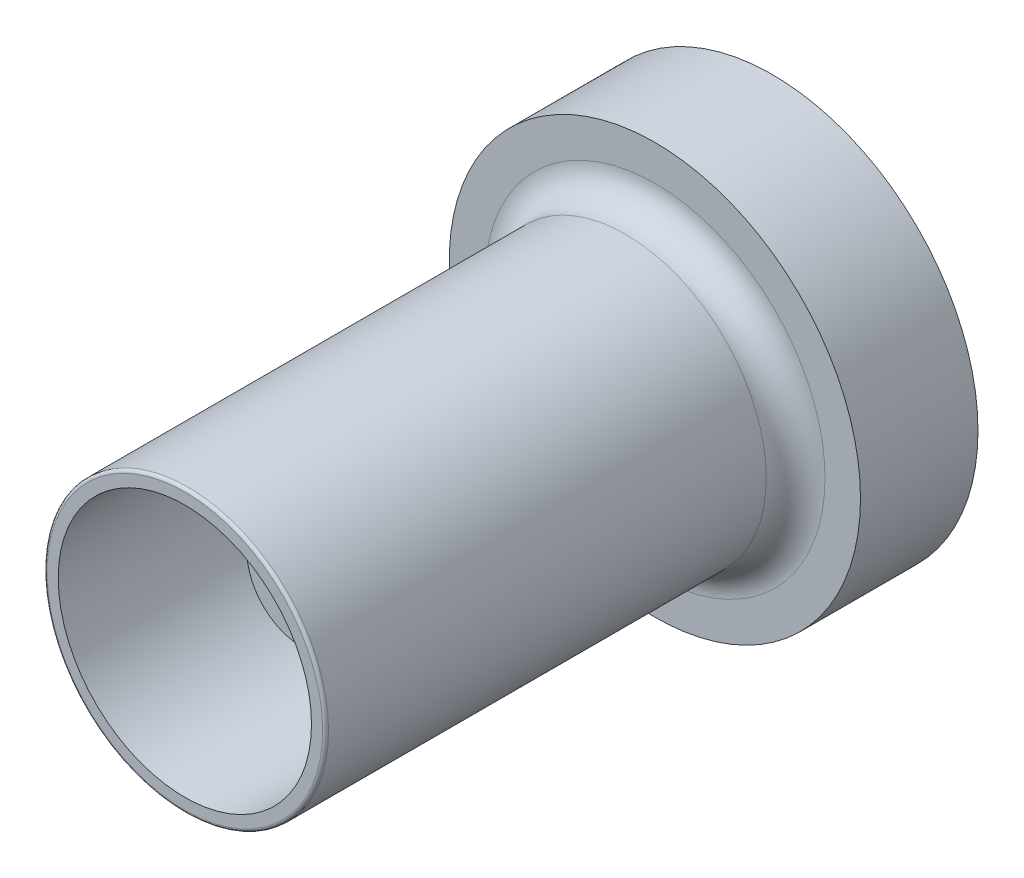
ISO-10303-21;
HEADER;
FILE_DESCRIPTION(('STEP AP214'),'2;1');
FILE_NAME('part.step','',(''),(''),'','','');
FILE_SCHEMA(('AUTOMOTIVE_DESIGN { 1 0 10303 214 1 1 1 1 }'));
ENDSEC;
DATA;
#1=APPLICATION_CONTEXT('core data for automotive mechanical design processes');
#2=APPLICATION_PROTOCOL_DEFINITION('international standard','automotive_design',2000,#1);
#3=PRODUCT_CONTEXT('',#1,'mechanical');
#4=PRODUCT('Part','Part','',(#3));
#5=PRODUCT_RELATED_PRODUCT_CATEGORY('part','',(#4));
#6=PRODUCT_DEFINITION_FORMATION('','',#4);
#7=PRODUCT_DEFINITION_CONTEXT('part definition',#1,'design');
#8=PRODUCT_DEFINITION('design','',#6,#7);
#9=PRODUCT_DEFINITION_SHAPE('','',#8);
#10=(LENGTH_UNIT() NAMED_UNIT(*) SI_UNIT(.MILLI.,.METRE.));
#11=(NAMED_UNIT(*) PLANE_ANGLE_UNIT() SI_UNIT($,.RADIAN.));
#12=(NAMED_UNIT(*) SI_UNIT($,.STERADIAN.) SOLID_ANGLE_UNIT());
#13=UNCERTAINTY_MEASURE_WITH_UNIT(LENGTH_MEASURE(1.E-05),#10,'distance_accuracy_value','');
#14=(GEOMETRIC_REPRESENTATION_CONTEXT(3) GLOBAL_UNCERTAINTY_ASSIGNED_CONTEXT((#13)) GLOBAL_UNIT_ASSIGNED_CONTEXT((#10,
#11,#12)) REPRESENTATION_CONTEXT('',''));
#15=CARTESIAN_POINT('',(0.,0.,0.));
#16=DIRECTION('',(0.,0.,1.));
#17=DIRECTION('',(1.,0.,0.));
#18=AXIS2_PLACEMENT_3D('',#15,#16,#17);
#19=CARTESIAN_POINT('',(0.,0.,4.));
#20=DIRECTION('',(0.,0.,-1.));
#21=DIRECTION('',(-1.,0.,0.));
#22=AXIS2_PLACEMENT_3D('',#19,#20,#21);
#23=CYLINDRICAL_SURFACE('',#22,7.);
#24=CARTESIAN_POINT('',(0.,0.,4.));
#25=DIRECTION('',(0.,0.,1.));
#26=DIRECTION('',(1.,0.,0.));
#27=AXIS2_PLACEMENT_3D('',#24,#25,#26);
#28=CIRCLE('',#27,7.);
#29=CARTESIAN_POINT('',(7.,0.,4.));
#30=VERTEX_POINT('',#29);
#31=EDGE_CURVE('E65',#30,#30,#28,.T.);
#32=ORIENTED_EDGE('',*,*,#31,.F.);
#33=EDGE_LOOP('',(#32));
#34=FACE_BOUND('',#33,.T.);
#35=CARTESIAN_POINT('',(0.,0.,0.));
#36=DIRECTION('',(0.,0.,1.));
#37=DIRECTION('',(1.,0.,0.));
#38=AXIS2_PLACEMENT_3D('',#35,#36,#37);
#39=CIRCLE('',#38,7.);
#40=CARTESIAN_POINT('',(7.,0.,0.));
#41=VERTEX_POINT('',#40);
#42=EDGE_CURVE('E66',#41,#41,#39,.T.);
#43=ORIENTED_EDGE('',*,*,#42,.T.);
#44=EDGE_LOOP('',(#43));
#45=FACE_BOUND('',#44,.T.);
#46=ADVANCED_FACE('F37',(#34,#45),#23,.T.);
#47=CARTESIAN_POINT('',(0.,0.,4.));
#48=DIRECTION('',(0.,0.,1.));
#49=DIRECTION('',(1.,0.,0.));
#50=AXIS2_PLACEMENT_3D('',#47,#48,#49);
#51=PLANE('',#50);
#52=CARTESIAN_POINT('',(0.,0.,4.));
#53=DIRECTION('',(0.,0.,1.));
#54=DIRECTION('',(1.,0.,0.));
#55=AXIS2_PLACEMENT_3D('',#52,#53,#54);
#56=CIRCLE('',#55,5.79128729213169);
#57=CARTESIAN_POINT('',(5.79128729213169,0.,4.));
#58=VERTEX_POINT('',#57);
#59=EDGE_CURVE('E50',#58,#58,#56,.F.);
#60=ORIENTED_EDGE('',*,*,#59,.T.);
#61=EDGE_LOOP('',(#60));
#62=FACE_BOUND('',#61,.T.);
#63=ORIENTED_EDGE('',*,*,#31,.T.);
#64=EDGE_LOOP('',(#63));
#65=FACE_BOUND('',#64,.T.);
#66=ADVANCED_FACE('F115',(#62,#65),#51,.T.);
#67=CARTESIAN_POINT('',(0.,0.,0.));
#68=DIRECTION('',(0.,0.,1.));
#69=DIRECTION('',(1.,0.,0.));
#70=AXIS2_PLACEMENT_3D('',#67,#68,#69);
#71=PLANE('',#70);
#72=ORIENTED_EDGE('',*,*,#42,.F.);
#73=EDGE_LOOP('',(#72));
#74=FACE_BOUND('',#73,.T.);
#75=ADVANCED_FACE('F121',(#74),#71,.F.);
#76=CARTESIAN_POINT('',(0.,0.,20.));
#77=DIRECTION('',(0.,0.,-1.));
#78=DIRECTION('',(-1.,0.,0.));
#79=AXIS2_PLACEMENT_3D('',#76,#77,#78);
#80=CYLINDRICAL_SURFACE('',#79,4.79128729213169);
#81=CARTESIAN_POINT('',(0.,0.,19.9));
#82=DIRECTION('',(0.,0.,1.));
#83=DIRECTION('',(1.,0.,0.));
#84=AXIS2_PLACEMENT_3D('',#81,#82,#83);
#85=CIRCLE('',#84,4.79128729213169);
#86=CARTESIAN_POINT('',(4.79128729213169,0.,19.9));
#87=VERTEX_POINT('',#86);
#88=EDGE_CURVE('E10',#87,#87,#85,.F.);
#89=ORIENTED_EDGE('',*,*,#88,.T.);
#90=EDGE_LOOP('',(#89));
#91=FACE_BOUND('',#90,.T.);
#92=CARTESIAN_POINT('',(0.,0.,5.));
#93=DIRECTION('',(0.,0.,1.));
#94=DIRECTION('',(1.,0.,0.));
#95=AXIS2_PLACEMENT_3D('',#92,#93,#94);
#96=CIRCLE('',#95,4.79128729213169);
#97=CARTESIAN_POINT('',(4.79128729213169,0.,5.));
#98=VERTEX_POINT('',#97);
#99=EDGE_CURVE('E55',#98,#98,#96,.T.);
#100=ORIENTED_EDGE('',*,*,#99,.T.);
#101=EDGE_LOOP('',(#100));
#102=FACE_BOUND('',#101,.T.);
#103=ADVANCED_FACE('F140',(#91,#102),#80,.T.);
#104=CARTESIAN_POINT('',(0.,0.,20.));
#105=DIRECTION('',(0.,0.,1.));
#106=DIRECTION('',(1.,0.,0.));
#107=AXIS2_PLACEMENT_3D('',#104,#105,#106);
#108=PLANE('',#107);
#109=CARTESIAN_POINT('',(0.,0.,20.));
#110=DIRECTION('',(0.,0.,1.));
#111=DIRECTION('',(1.,0.,0.));
#112=AXIS2_PLACEMENT_3D('',#109,#110,#111);
#113=CIRCLE('',#112,4.69128729213169);
#114=CARTESIAN_POINT('',(4.69128729213169,0.,20.));
#115=VERTEX_POINT('',#114);
#116=EDGE_CURVE('E45',#115,#115,#113,.T.);
#117=ORIENTED_EDGE('',*,*,#116,.T.);
#118=EDGE_LOOP('',(#117));
#119=FACE_BOUND('',#118,.T.);
#120=CARTESIAN_POINT('',(0.,0.,20.));
#121=DIRECTION('',(0.,0.,1.));
#122=DIRECTION('',(1.,0.,0.));
#123=AXIS2_PLACEMENT_3D('',#120,#121,#122);
#124=CIRCLE('',#123,4.31035980804725);
#125=CARTESIAN_POINT('',(4.31035980804725,0.,20.));
#126=VERTEX_POINT('',#125);
#127=EDGE_CURVE('E74',#126,#126,#124,.T.);
#128=ORIENTED_EDGE('',*,*,#127,.F.);
#129=EDGE_LOOP('',(#128));
#130=FACE_BOUND('',#129,.T.);
#131=ADVANCED_FACE('F142',(#119,#130),#108,.T.);
#132=CARTESIAN_POINT('',(0.,0.,4.));
#133=DIRECTION('',(0.,0.,1.));
#134=DIRECTION('',(1.,0.,0.));
#135=AXIS2_PLACEMENT_3D('',#132,#133,#134);
#136=CYLINDRICAL_SURFACE('',#135,4.31035980804725);
#137=CARTESIAN_POINT('',(0.,0.,4.));
#138=DIRECTION('',(0.,0.,1.));
#139=DIRECTION('',(1.,0.,0.));
#140=AXIS2_PLACEMENT_3D('',#137,#138,#139);
#141=CIRCLE('',#140,4.31035980804725);
#142=CARTESIAN_POINT('',(4.31035980804725,0.,4.));
#143=VERTEX_POINT('',#142);
#144=EDGE_CURVE('E70',#143,#143,#141,.T.);
#145=ORIENTED_EDGE('',*,*,#144,.F.);
#146=EDGE_LOOP('',(#145));
#147=FACE_BOUND('',#146,.T.);
#148=ORIENTED_EDGE('',*,*,#127,.T.);
#149=EDGE_LOOP('',(#148));
#150=FACE_BOUND('',#149,.T.);
#151=ADVANCED_FACE('F109',(#147,#150),#136,.F.);
#152=CARTESIAN_POINT('',(0.,0.,4.));
#153=DIRECTION('',(0.,0.,1.));
#154=DIRECTION('',(1.,0.,0.));
#155=AXIS2_PLACEMENT_3D('',#152,#153,#154);
#156=PLANE('',#155);
#157=CARTESIAN_POINT('',(0.,0.,4.));
#158=DIRECTION('',(0.,0.,1.));
#159=DIRECTION('',(1.,0.,0.));
#160=AXIS2_PLACEMENT_3D('',#157,#158,#159);
#161=CIRCLE('',#160,1.88907533740145);
#162=CARTESIAN_POINT('',(1.88907533740145,0.,4.));
#163=VERTEX_POINT('',#162);
#164=EDGE_CURVE('E82',#163,#163,#161,.T.);
#165=ORIENTED_EDGE('',*,*,#164,.F.);
#166=EDGE_LOOP('',(#165));
#167=FACE_BOUND('',#166,.T.);
#168=ORIENTED_EDGE('',*,*,#144,.T.);
#169=EDGE_LOOP('',(#168));
#170=FACE_BOUND('',#169,.T.);
#171=ADVANCED_FACE('F100',(#167,#170),#156,.T.);
#172=CARTESIAN_POINT('',(0.,0.,16.));
#173=DIRECTION('',(0.,0.,1.));
#174=DIRECTION('',(1.,0.,0.));
#175=AXIS2_PLACEMENT_3D('',#172,#173,#174);
#176=PLANE('',#175);
#177=CARTESIAN_POINT('',(0.,0.,16.));
#178=DIRECTION('',(0.,0.,1.));
#179=DIRECTION('',(1.,0.,0.));
#180=AXIS2_PLACEMENT_3D('',#177,#178,#179);
#181=CIRCLE('',#180,1.88907533740145);
#182=CARTESIAN_POINT('',(1.88907533740145,0.,16.));
#183=VERTEX_POINT('',#182);
#184=EDGE_CURVE('E78',#183,#183,#181,.T.);
#185=ORIENTED_EDGE('',*,*,#184,.T.);
#186=EDGE_LOOP('',(#185));
#187=FACE_BOUND('',#186,.T.);
#188=CARTESIAN_POINT('',(0.,0.,16.));
#189=DIRECTION('',(0.,0.,1.));
#190=DIRECTION('',(1.,0.,0.));
#191=AXIS2_PLACEMENT_3D('',#188,#189,#190);
#192=CIRCLE('',#191,1.19113008100481);
#193=CARTESIAN_POINT('',(1.19113008100481,0.,16.));
#194=VERTEX_POINT('',#193);
#195=EDGE_CURVE('E86',#194,#194,#192,.T.);
#196=ORIENTED_EDGE('',*,*,#195,.F.);
#197=EDGE_LOOP('',(#196));
#198=FACE_BOUND('',#197,.T.);
#199=ADVANCED_FACE('F97',(#187,#198),#176,.T.);
#200=CARTESIAN_POINT('',(0.,0.,16.));
#201=DIRECTION('',(0.,0.,-1.));
#202=DIRECTION('',(-1.,0.,0.));
#203=AXIS2_PLACEMENT_3D('',#200,#201,#202);
#204=CYLINDRICAL_SURFACE('',#203,1.88907533740145);
#205=ORIENTED_EDGE('',*,*,#184,.F.);
#206=EDGE_LOOP('',(#205));
#207=FACE_BOUND('',#206,.T.);
#208=ORIENTED_EDGE('',*,*,#164,.T.);
#209=EDGE_LOOP('',(#208));
#210=FACE_BOUND('',#209,.T.);
#211=ADVANCED_FACE('F99',(#207,#210),#204,.T.);
#212=CARTESIAN_POINT('',(0.,0.,16.));
#213=DIRECTION('',(0.,0.,-1.));
#214=DIRECTION('',(-1.,0.,0.));
#215=AXIS2_PLACEMENT_3D('',#212,#213,#214);
#216=CYLINDRICAL_SURFACE('',#215,1.19113008100481);
#217=ORIENTED_EDGE('',*,*,#195,.T.);
#218=EDGE_LOOP('',(#217));
#219=FACE_BOUND('',#218,.T.);
#220=CARTESIAN_POINT('',(0.,0.,4.));
#221=DIRECTION('',(0.,0.,1.));
#222=DIRECTION('',(1.,0.,0.));
#223=AXIS2_PLACEMENT_3D('',#220,#221,#222);
#224=CIRCLE('',#223,1.19113008100481);
#225=CARTESIAN_POINT('',(1.19113008100481,0.,4.));
#226=VERTEX_POINT('',#225);
#227=EDGE_CURVE('E61',#226,#226,#224,.F.);
#228=ORIENTED_EDGE('',*,*,#227,.T.);
#229=EDGE_LOOP('',(#228));
#230=FACE_BOUND('',#229,.T.);
#231=ADVANCED_FACE('F94',(#219,#230),#216,.F.);
#232=ORIENTED_EDGE('',*,*,#227,.F.);
#233=EDGE_LOOP('',(#232));
#234=FACE_BOUND('',#233,.T.);
#235=ADVANCED_FACE('F112',(#234),#156,.T.);
#236=CARTESIAN_POINT('',(0.,0.,5.));
#237=DIRECTION('',(0.,0.,1.));
#238=DIRECTION('',(1.,0.,0.));
#239=AXIS2_PLACEMENT_3D('',#236,#237,#238);
#240=TOROIDAL_SURFACE('',#239,5.79128729213169,1.);
#241=ORIENTED_EDGE('',*,*,#59,.F.);
#242=EDGE_LOOP('',(#241));
#243=FACE_BOUND('',#242,.T.);
#244=ORIENTED_EDGE('',*,*,#99,.F.);
#245=EDGE_LOOP('',(#244));
#246=FACE_BOUND('',#245,.T.);
#247=ADVANCED_FACE('F127',(#243,#246),#240,.F.);
#248=CARTESIAN_POINT('',(0.,0.,19.9));
#249=DIRECTION('',(0.,0.,1.));
#250=DIRECTION('',(1.,0.,0.));
#251=AXIS2_PLACEMENT_3D('',#248,#249,#250);
#252=TOROIDAL_SURFACE('',#251,4.69128729213169,0.1);
#253=ORIENTED_EDGE('',*,*,#88,.F.);
#254=EDGE_LOOP('',(#253));
#255=FACE_BOUND('',#254,.T.);
#256=ORIENTED_EDGE('',*,*,#116,.F.);
#257=EDGE_LOOP('',(#256));
#258=FACE_BOUND('',#257,.T.);
#259=ADVANCED_FACE('F39',(#255,#258),#252,.T.);
#260=CLOSED_SHELL('',(#46,#66,#75,#103,#131,#151,#171,#199,#211,#231,#235,#247,#259));
#261=MANIFOLD_SOLID_BREP('B2',#260);
#262=ADVANCED_BREP_SHAPE_REPRESENTATION('',(#18,#261),#14);
#263=SHAPE_DEFINITION_REPRESENTATION(#9,#262);
ENDSEC;
END-ISO-10303-21;
